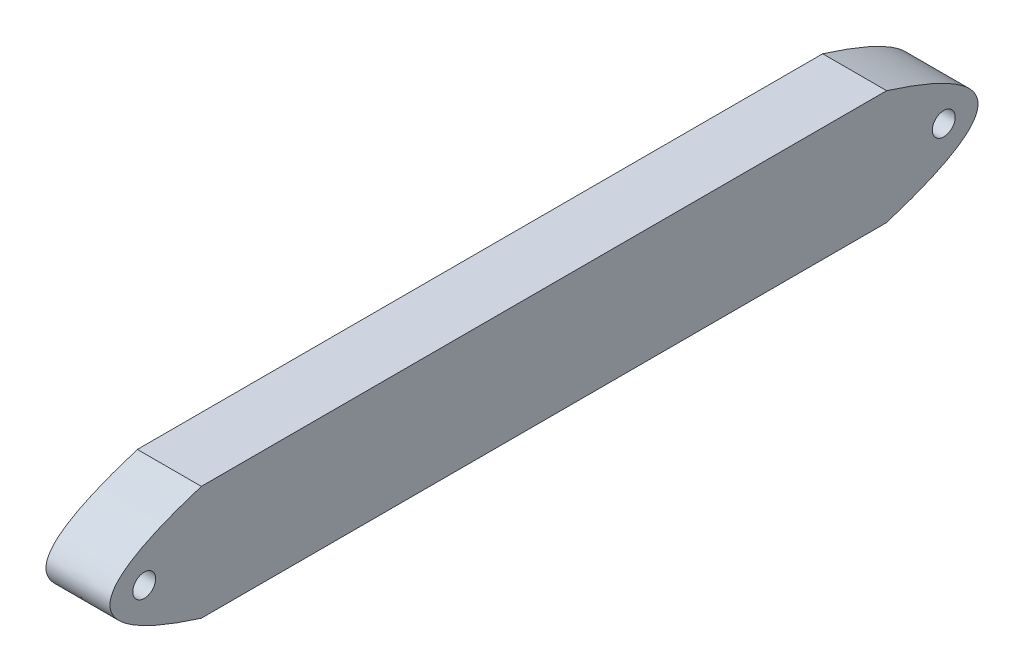
ISO-10303-21;
HEADER;
FILE_DESCRIPTION(('STEP AP214'),'2;1');
FILE_NAME('part.step','',(''),(''),'','','');
FILE_SCHEMA(('AUTOMOTIVE_DESIGN { 1 0 10303 214 1 1 1 1 }'));
ENDSEC;
DATA;
#1=APPLICATION_CONTEXT('core data for automotive mechanical design processes');
#2=APPLICATION_PROTOCOL_DEFINITION('international standard','automotive_design',2000,#1);
#3=PRODUCT_CONTEXT('',#1,'mechanical');
#4=PRODUCT('Part','Part','',(#3));
#5=PRODUCT_RELATED_PRODUCT_CATEGORY('part','',(#4));
#6=PRODUCT_DEFINITION_FORMATION('','',#4);
#7=PRODUCT_DEFINITION_CONTEXT('part definition',#1,'design');
#8=PRODUCT_DEFINITION('design','',#6,#7);
#9=PRODUCT_DEFINITION_SHAPE('','',#8);
#10=(LENGTH_UNIT() NAMED_UNIT(*) SI_UNIT(.MILLI.,.METRE.));
#11=(NAMED_UNIT(*) PLANE_ANGLE_UNIT() SI_UNIT($,.RADIAN.));
#12=(NAMED_UNIT(*) SI_UNIT($,.STERADIAN.) SOLID_ANGLE_UNIT());
#13=UNCERTAINTY_MEASURE_WITH_UNIT(LENGTH_MEASURE(1.E-05),#10,'distance_accuracy_value','');
#14=(GEOMETRIC_REPRESENTATION_CONTEXT(3) GLOBAL_UNCERTAINTY_ASSIGNED_CONTEXT((#13)) GLOBAL_UNIT_ASSIGNED_CONTEXT((#10,
#11,#12)) REPRESENTATION_CONTEXT('',''));
#15=CARTESIAN_POINT('',(0.,0.,0.));
#16=DIRECTION('',(0.,0.,1.));
#17=DIRECTION('',(1.,0.,0.));
#18=AXIS2_PLACEMENT_3D('',#15,#16,#17);
#19=CARTESIAN_POINT('',(28.,7.6811820792777E-11,190.));
#20=DIRECTION('',(-1.,0.,0.));
#21=DIRECTION('',(0.,0.,1.));
#22=AXIS2_PLACEMENT_3D('',#19,#20,#21);
#23=PLANE('',#22);
#24=CARTESIAN_POINT('',(28.,25.,150.));
#25=CARTESIAN_POINT('',(28.,1.53623641585554E-10,230.));
#26=CARTESIAN_POINT('',(28.,-25.,150.));
#27=B_SPLINE_CURVE_WITH_KNOTS('',2,(#24,#25,#26),.UNSPECIFIED.,.F.,.F.,(3,3),(0.,1.),.UNSPECIFIED.);
#28=CARTESIAN_POINT('',(28.,25.,150.));
#29=VERTEX_POINT('',#28);
#30=CARTESIAN_POINT('',(28.,-25.,150.));
#31=VERTEX_POINT('',#30);
#32=EDGE_CURVE('E93',#29,#31,#27,.T.);
#33=ORIENTED_EDGE('',*,*,#32,.T.);
#34=DIRECTION('',(0.,0.,-1.));
#35=VECTOR('',#34,1.);
#36=CARTESIAN_POINT('',(28.,-25.,150.));
#37=LINE('',#36,#35);
#38=CARTESIAN_POINT('',(28.,-25.,-150.));
#39=VERTEX_POINT('',#38);
#40=EDGE_CURVE('E88',#31,#39,#37,.T.);
#41=ORIENTED_EDGE('',*,*,#40,.T.);
#42=CARTESIAN_POINT('',(28.,-25.,-150.));
#43=CARTESIAN_POINT('',(28.,0.,-230.));
#44=CARTESIAN_POINT('',(28.,25.,-150.));
#45=B_SPLINE_CURVE_WITH_KNOTS('',2,(#42,#43,#44),.UNSPECIFIED.,.F.,.F.,(3,3),(0.,1.),.UNSPECIFIED.);
#46=CARTESIAN_POINT('',(28.,25.,-150.));
#47=VERTEX_POINT('',#46);
#48=EDGE_CURVE('E91',#39,#47,#45,.T.);
#49=ORIENTED_EDGE('',*,*,#48,.T.);
#50=DIRECTION('',(0.,0.,1.));
#51=VECTOR('',#50,1.);
#52=CARTESIAN_POINT('',(28.,25.,150.));
#53=LINE('',#52,#51);
#54=EDGE_CURVE('E58',#47,#29,#53,.T.);
#55=ORIENTED_EDGE('',*,*,#54,.T.);
#56=EDGE_LOOP('',(#33,#41,#49,#55));
#57=FACE_BOUND('',#56,.T.);
#58=CARTESIAN_POINT('',(28.,1.06810393862844E-10,175.));
#59=DIRECTION('',(1.,0.,0.));
#60=DIRECTION('',(0.,0.,-1.));
#61=AXIS2_PLACEMENT_3D('',#58,#59,#60);
#62=CIRCLE('',#61,4.99999999999999);
#63=CARTESIAN_POINT('',(28.,1.06810393862844E-10,170.));
#64=VERTEX_POINT('',#63);
#65=EDGE_CURVE('E155',#64,#64,#62,.T.);
#66=ORIENTED_EDGE('',*,*,#65,.F.);
#67=EDGE_LOOP('',(#66));
#68=FACE_BOUND('',#67,.T.);
#69=CARTESIAN_POINT('',(28.,0.,-175.));
#70=DIRECTION('',(1.,0.,0.));
#71=DIRECTION('',(0.,0.,-1.));
#72=AXIS2_PLACEMENT_3D('',#69,#70,#71);
#73=CIRCLE('',#72,4.99999999999999);
#74=CARTESIAN_POINT('',(28.,0.,-180.));
#75=VERTEX_POINT('',#74);
#76=EDGE_CURVE('E144',#75,#75,#73,.T.);
#77=ORIENTED_EDGE('',*,*,#76,.F.);
#78=EDGE_LOOP('',(#77));
#79=FACE_BOUND('',#78,.T.);
#80=ADVANCED_FACE('F39',(#57,#68,#79),#23,.F.);
#81=CARTESIAN_POINT('',(0.,7.6811820792777E-11,190.));
#82=DIRECTION('',(-1.,0.,0.));
#83=DIRECTION('',(0.,0.,1.));
#84=AXIS2_PLACEMENT_3D('',#81,#82,#83);
#85=PLANE('',#84);
#86=CARTESIAN_POINT('',(0.,1.06810393862844E-10,175.));
#87=DIRECTION('',(1.,0.,0.));
#88=DIRECTION('',(0.,0.,-1.));
#89=AXIS2_PLACEMENT_3D('',#86,#87,#88);
#90=CIRCLE('',#89,4.99999999999999);
#91=CARTESIAN_POINT('',(0.,1.06810393862844E-10,170.));
#92=VERTEX_POINT('',#91);
#93=EDGE_CURVE('E152',#92,#92,#90,.T.);
#94=ORIENTED_EDGE('',*,*,#93,.T.);
#95=EDGE_LOOP('',(#94));
#96=FACE_BOUND('',#95,.T.);
#97=CARTESIAN_POINT('',(0.,25.,150.));
#98=CARTESIAN_POINT('',(0.,1.53623641585554E-10,230.));
#99=CARTESIAN_POINT('',(0.,-25.,150.));
#100=B_SPLINE_CURVE_WITH_KNOTS('',2,(#97,#98,#99),.UNSPECIFIED.,.F.,.F.,(3,3),(0.,1.),.UNSPECIFIED.);
#101=CARTESIAN_POINT('',(0.,25.,150.));
#102=VERTEX_POINT('',#101);
#103=CARTESIAN_POINT('',(0.,-25.,150.));
#104=VERTEX_POINT('',#103);
#105=EDGE_CURVE('E159',#102,#104,#100,.T.);
#106=ORIENTED_EDGE('',*,*,#105,.F.);
#107=DIRECTION('',(0.,0.,1.));
#108=VECTOR('',#107,1.);
#109=CARTESIAN_POINT('',(0.,25.,150.));
#110=LINE('',#109,#108);
#111=CARTESIAN_POINT('',(0.,25.,-150.));
#112=VERTEX_POINT('',#111);
#113=EDGE_CURVE('E81',#112,#102,#110,.T.);
#114=ORIENTED_EDGE('',*,*,#113,.F.);
#115=CARTESIAN_POINT('',(0.,-25.,-150.));
#116=CARTESIAN_POINT('',(0.,0.,-230.));
#117=CARTESIAN_POINT('',(0.,25.,-150.));
#118=B_SPLINE_CURVE_WITH_KNOTS('',2,(#115,#116,#117),.UNSPECIFIED.,.F.,.F.,(3,3),(0.,1.),.UNSPECIFIED.);
#119=CARTESIAN_POINT('',(0.,-25.,-150.));
#120=VERTEX_POINT('',#119);
#121=EDGE_CURVE('E75',#120,#112,#118,.T.);
#122=ORIENTED_EDGE('',*,*,#121,.F.);
#123=DIRECTION('',(0.,0.,-1.));
#124=VECTOR('',#123,1.);
#125=CARTESIAN_POINT('',(0.,-25.,150.));
#126=LINE('',#125,#124);
#127=EDGE_CURVE('E98',#104,#120,#126,.T.);
#128=ORIENTED_EDGE('',*,*,#127,.F.);
#129=EDGE_LOOP('',(#106,#114,#122,#128));
#130=FACE_BOUND('',#129,.T.);
#131=CARTESIAN_POINT('',(0.,0.,-175.));
#132=DIRECTION('',(1.,0.,0.));
#133=DIRECTION('',(0.,0.,-1.));
#134=AXIS2_PLACEMENT_3D('',#131,#132,#133);
#135=CIRCLE('',#134,4.99999999999999);
#136=CARTESIAN_POINT('',(0.,0.,-180.));
#137=VERTEX_POINT('',#136);
#138=EDGE_CURVE('E147',#137,#137,#135,.T.);
#139=ORIENTED_EDGE('',*,*,#138,.T.);
#140=EDGE_LOOP('',(#139));
#141=FACE_BOUND('',#140,.T.);
#142=ADVANCED_FACE('F123',(#96,#130,#141),#85,.T.);
#143=DIRECTION('',(-1.,0.,0.));
#144=VECTOR('',#143,1.);
#145=SURFACE_OF_LINEAR_EXTRUSION('',#27,#144);
#146=ORIENTED_EDGE('',*,*,#105,.T.);
#147=DIRECTION('',(-1.,0.,0.));
#148=VECTOR('',#147,1.);
#149=CARTESIAN_POINT('',(28.,-25.,150.));
#150=LINE('',#149,#148);
#151=EDGE_CURVE('E11',#31,#104,#150,.T.);
#152=ORIENTED_EDGE('',*,*,#151,.F.);
#153=ORIENTED_EDGE('',*,*,#32,.F.);
#154=DIRECTION('',(-1.,0.,0.));
#155=VECTOR('',#154,1.);
#156=CARTESIAN_POINT('',(28.,25.,150.));
#157=LINE('',#156,#155);
#158=EDGE_CURVE('E105',#29,#102,#157,.T.);
#159=ORIENTED_EDGE('',*,*,#158,.T.);
#160=EDGE_LOOP('',(#146,#152,#153,#159));
#161=FACE_BOUND('',#160,.T.);
#162=ADVANCED_FACE('F41',(#161),#145,.F.);
#163=CARTESIAN_POINT('',(28.,-25.,150.));
#164=DIRECTION('',(0.,1.,0.));
#165=DIRECTION('',(0.,0.,1.));
#166=AXIS2_PLACEMENT_3D('',#163,#164,#165);
#167=PLANE('',#166);
#168=ORIENTED_EDGE('',*,*,#127,.T.);
#169=DIRECTION('',(-1.,0.,0.));
#170=VECTOR('',#169,1.);
#171=CARTESIAN_POINT('',(28.,-25.,-150.));
#172=LINE('',#171,#170);
#173=EDGE_CURVE('E50',#39,#120,#172,.T.);
#174=ORIENTED_EDGE('',*,*,#173,.F.);
#175=ORIENTED_EDGE('',*,*,#40,.F.);
#176=ORIENTED_EDGE('',*,*,#151,.T.);
#177=EDGE_LOOP('',(#168,#174,#175,#176));
#178=FACE_BOUND('',#177,.T.);
#179=ADVANCED_FACE('F97',(#178),#167,.F.);
#180=DIRECTION('',(-1.,0.,0.));
#181=VECTOR('',#180,1.);
#182=SURFACE_OF_LINEAR_EXTRUSION('',#45,#181);
#183=ORIENTED_EDGE('',*,*,#121,.T.);
#184=DIRECTION('',(-1.,0.,0.));
#185=VECTOR('',#184,1.);
#186=CARTESIAN_POINT('',(28.,25.,-150.));
#187=LINE('',#186,#185);
#188=EDGE_CURVE('E100',#47,#112,#187,.T.);
#189=ORIENTED_EDGE('',*,*,#188,.F.);
#190=ORIENTED_EDGE('',*,*,#48,.F.);
#191=ORIENTED_EDGE('',*,*,#173,.T.);
#192=EDGE_LOOP('',(#183,#189,#190,#191));
#193=FACE_BOUND('',#192,.T.);
#194=ADVANCED_FACE('F101',(#193),#182,.F.);
#195=CARTESIAN_POINT('',(28.,25.,150.));
#196=DIRECTION('',(0.,-1.,0.));
#197=DIRECTION('',(0.,0.,-1.));
#198=AXIS2_PLACEMENT_3D('',#195,#196,#197);
#199=PLANE('',#198);
#200=ORIENTED_EDGE('',*,*,#113,.T.);
#201=ORIENTED_EDGE('',*,*,#158,.F.);
#202=ORIENTED_EDGE('',*,*,#54,.F.);
#203=ORIENTED_EDGE('',*,*,#188,.T.);
#204=EDGE_LOOP('',(#200,#201,#202,#203));
#205=FACE_BOUND('',#204,.T.);
#206=ADVANCED_FACE('F117',(#205),#199,.F.);
#207=CARTESIAN_POINT('',(28.,1.06810393862844E-10,175.));
#208=DIRECTION('',(-1.,0.,0.));
#209=DIRECTION('',(0.,0.,1.));
#210=AXIS2_PLACEMENT_3D('',#207,#208,#209);
#211=CYLINDRICAL_SURFACE('',#210,4.99999999999999);
#212=ORIENTED_EDGE('',*,*,#65,.T.);
#213=EDGE_LOOP('',(#212));
#214=FACE_BOUND('',#213,.T.);
#215=ORIENTED_EDGE('',*,*,#93,.F.);
#216=EDGE_LOOP('',(#215));
#217=FACE_BOUND('',#216,.T.);
#218=ADVANCED_FACE('F132',(#214,#217),#211,.F.);
#219=CARTESIAN_POINT('',(28.,0.,-175.));
#220=DIRECTION('',(-1.,0.,0.));
#221=DIRECTION('',(0.,0.,1.));
#222=AXIS2_PLACEMENT_3D('',#219,#220,#221);
#223=CYLINDRICAL_SURFACE('',#222,4.99999999999999);
#224=ORIENTED_EDGE('',*,*,#76,.T.);
#225=EDGE_LOOP('',(#224));
#226=FACE_BOUND('',#225,.T.);
#227=ORIENTED_EDGE('',*,*,#138,.F.);
#228=EDGE_LOOP('',(#227));
#229=FACE_BOUND('',#228,.T.);
#230=ADVANCED_FACE('F135',(#226,#229),#223,.F.);
#231=CLOSED_SHELL('',(#80,#142,#162,#179,#194,#206,#218,#230));
#232=MANIFOLD_SOLID_BREP('B2',#231);
#233=ADVANCED_BREP_SHAPE_REPRESENTATION('',(#18,#232),#14);
#234=SHAPE_DEFINITION_REPRESENTATION(#9,#233);
ENDSEC;
END-ISO-10303-21;
